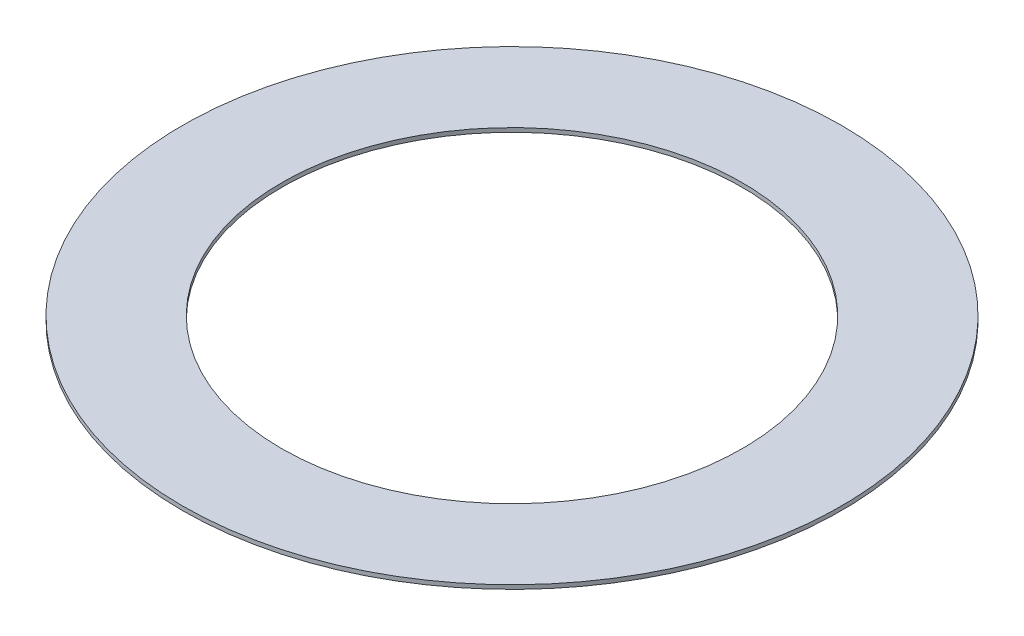
ISO-10303-21;
HEADER;
FILE_DESCRIPTION(('STEP AP214'),'2;1');
FILE_NAME('part.step','',(''),(''),'','','');
FILE_SCHEMA(('AUTOMOTIVE_DESIGN { 1 0 10303 214 1 1 1 1 }'));
ENDSEC;
DATA;
#1=APPLICATION_CONTEXT('core data for automotive mechanical design processes');
#2=APPLICATION_PROTOCOL_DEFINITION('international standard','automotive_design',2000,#1);
#3=PRODUCT_CONTEXT('',#1,'mechanical');
#4=PRODUCT('Part','Part','',(#3));
#5=PRODUCT_RELATED_PRODUCT_CATEGORY('part','',(#4));
#6=PRODUCT_DEFINITION_FORMATION('','',#4);
#7=PRODUCT_DEFINITION_CONTEXT('part definition',#1,'design');
#8=PRODUCT_DEFINITION('design','',#6,#7);
#9=PRODUCT_DEFINITION_SHAPE('','',#8);
#10=(LENGTH_UNIT() NAMED_UNIT(*) SI_UNIT(.MILLI.,.METRE.));
#11=(NAMED_UNIT(*) PLANE_ANGLE_UNIT() SI_UNIT($,.RADIAN.));
#12=(NAMED_UNIT(*) SI_UNIT($,.STERADIAN.) SOLID_ANGLE_UNIT());
#13=UNCERTAINTY_MEASURE_WITH_UNIT(LENGTH_MEASURE(1.E-05),#10,'distance_accuracy_value','');
#14=(GEOMETRIC_REPRESENTATION_CONTEXT(3) GLOBAL_UNCERTAINTY_ASSIGNED_CONTEXT((#13)) GLOBAL_UNIT_ASSIGNED_CONTEXT((#10,
#11,#12)) REPRESENTATION_CONTEXT('',''));
#15=CARTESIAN_POINT('',(0.,0.,0.));
#16=DIRECTION('',(0.,0.,1.));
#17=DIRECTION('',(1.,0.,0.));
#18=AXIS2_PLACEMENT_3D('',#15,#16,#17);
#19=CARTESIAN_POINT('',(0.,3.,0.));
#20=DIRECTION('',(0.,1.,0.));
#21=DIRECTION('',(0.,0.,1.));
#22=AXIS2_PLACEMENT_3D('',#19,#20,#21);
#23=PLANE('',#22);
#24=CARTESIAN_POINT('',(0.,3.,0.));
#25=DIRECTION('',(0.,1.,0.));
#26=DIRECTION('',(0.,0.,1.));
#27=AXIS2_PLACEMENT_3D('',#24,#25,#26);
#28=CIRCLE('',#27,243.072438069683);
#29=CARTESIAN_POINT('',(0.,3.,243.072438069683));
#30=VERTEX_POINT('',#29);
#31=EDGE_CURVE('E10',#30,#30,#28,.T.);
#32=ORIENTED_EDGE('',*,*,#31,.T.);
#33=EDGE_LOOP('',(#32));
#34=FACE_BOUND('',#33,.T.);
#35=CARTESIAN_POINT('',(0.,3.,0.));
#36=DIRECTION('',(0.,1.,0.));
#37=DIRECTION('',(0.,0.,1.));
#38=AXIS2_PLACEMENT_3D('',#35,#36,#37);
#39=CIRCLE('',#38,169.891157401779);
#40=CARTESIAN_POINT('',(0.,3.,169.891157401779));
#41=VERTEX_POINT('',#40);
#42=EDGE_CURVE('E42',#41,#41,#39,.T.);
#43=ORIENTED_EDGE('',*,*,#42,.F.);
#44=EDGE_LOOP('',(#43));
#45=FACE_BOUND('',#44,.T.);
#46=ADVANCED_FACE('F31',(#34,#45),#23,.T.);
#47=CARTESIAN_POINT('',(0.,0.,0.));
#48=DIRECTION('',(0.,1.,0.));
#49=DIRECTION('',(0.,0.,1.));
#50=AXIS2_PLACEMENT_3D('',#47,#48,#49);
#51=PLANE('',#50);
#52=CARTESIAN_POINT('',(0.,0.,0.));
#53=DIRECTION('',(0.,1.,0.));
#54=DIRECTION('',(0.,0.,1.));
#55=AXIS2_PLACEMENT_3D('',#52,#53,#54);
#56=CIRCLE('',#55,243.072438069683);
#57=CARTESIAN_POINT('',(0.,0.,243.072438069683));
#58=VERTEX_POINT('',#57);
#59=EDGE_CURVE('E35',#58,#58,#56,.T.);
#60=ORIENTED_EDGE('',*,*,#59,.F.);
#61=EDGE_LOOP('',(#60));
#62=FACE_BOUND('',#61,.T.);
#63=CARTESIAN_POINT('',(0.,0.,0.));
#64=DIRECTION('',(0.,1.,0.));
#65=DIRECTION('',(0.,0.,1.));
#66=AXIS2_PLACEMENT_3D('',#63,#64,#65);
#67=CIRCLE('',#66,169.891157401779);
#68=CARTESIAN_POINT('',(0.,0.,169.891157401779));
#69=VERTEX_POINT('',#68);
#70=EDGE_CURVE('E44',#69,#69,#67,.T.);
#71=ORIENTED_EDGE('',*,*,#70,.T.);
#72=EDGE_LOOP('',(#71));
#73=FACE_BOUND('',#72,.T.);
#74=ADVANCED_FACE('F54',(#62,#73),#51,.F.);
#75=CARTESIAN_POINT('',(0.,3.,0.));
#76=DIRECTION('',(0.,-1.,0.));
#77=DIRECTION('',(0.,0.,-1.));
#78=AXIS2_PLACEMENT_3D('',#75,#76,#77);
#79=CYLINDRICAL_SURFACE('',#78,243.072438069683);
#80=ORIENTED_EDGE('',*,*,#31,.F.);
#81=EDGE_LOOP('',(#80));
#82=FACE_BOUND('',#81,.T.);
#83=ORIENTED_EDGE('',*,*,#59,.T.);
#84=EDGE_LOOP('',(#83));
#85=FACE_BOUND('',#84,.T.);
#86=ADVANCED_FACE('F33',(#82,#85),#79,.T.);
#87=CARTESIAN_POINT('',(0.,3.,0.));
#88=DIRECTION('',(0.,-1.,0.));
#89=DIRECTION('',(0.,0.,-1.));
#90=AXIS2_PLACEMENT_3D('',#87,#88,#89);
#91=CYLINDRICAL_SURFACE('',#90,169.891157401779);
#92=ORIENTED_EDGE('',*,*,#42,.T.);
#93=EDGE_LOOP('',(#92));
#94=FACE_BOUND('',#93,.T.);
#95=ORIENTED_EDGE('',*,*,#70,.F.);
#96=EDGE_LOOP('',(#95));
#97=FACE_BOUND('',#96,.T.);
#98=ADVANCED_FACE('F50',(#94,#97),#91,.F.);
#99=CLOSED_SHELL('',(#46,#74,#86,#98));
#100=MANIFOLD_SOLID_BREP('B2',#99);
#101=ADVANCED_BREP_SHAPE_REPRESENTATION('',(#18,#100),#14);
#102=SHAPE_DEFINITION_REPRESENTATION(#9,#101);
ENDSEC;
END-ISO-10303-21;
